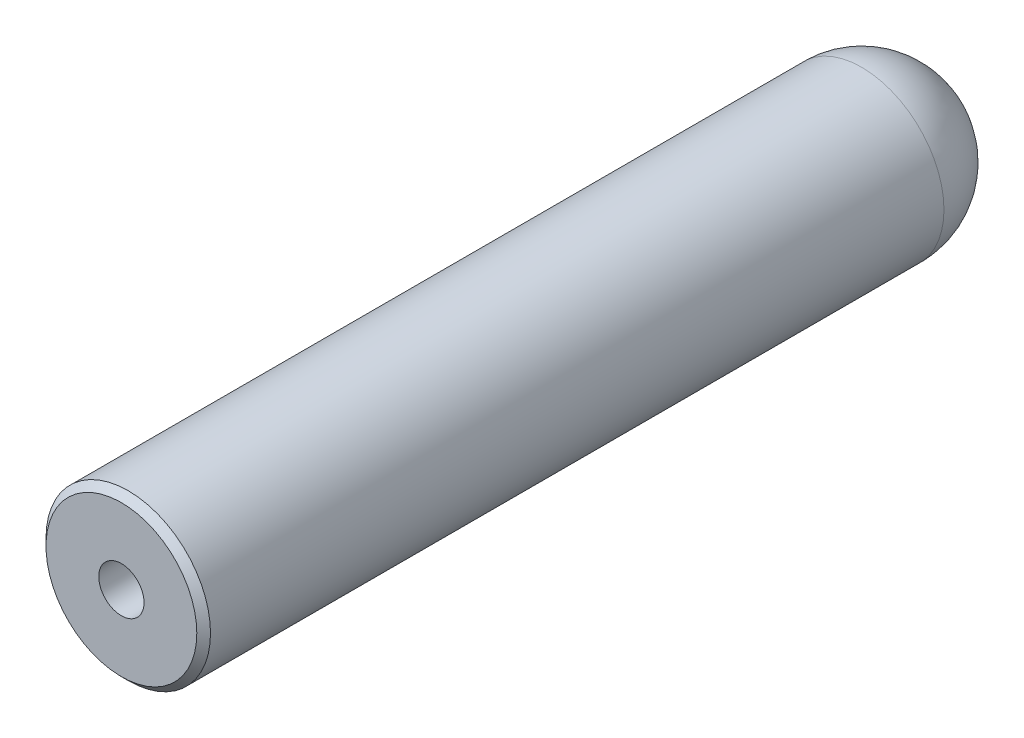
ISO-10303-21;
HEADER;
FILE_DESCRIPTION(('STEP AP214'),'2;1');
FILE_NAME('part.step','',(''),(''),'','','');
FILE_SCHEMA(('AUTOMOTIVE_DESIGN { 1 0 10303 214 1 1 1 1 }'));
ENDSEC;
DATA;
#1=APPLICATION_CONTEXT('core data for automotive mechanical design processes');
#2=APPLICATION_PROTOCOL_DEFINITION('international standard','automotive_design',2000,#1);
#3=PRODUCT_CONTEXT('',#1,'mechanical');
#4=PRODUCT('Part','Part','',(#3));
#5=PRODUCT_RELATED_PRODUCT_CATEGORY('part','',(#4));
#6=PRODUCT_DEFINITION_FORMATION('','',#4);
#7=PRODUCT_DEFINITION_CONTEXT('part definition',#1,'design');
#8=PRODUCT_DEFINITION('design','',#6,#7);
#9=PRODUCT_DEFINITION_SHAPE('','',#8);
#10=(LENGTH_UNIT() NAMED_UNIT(*) SI_UNIT(.MILLI.,.METRE.));
#11=(NAMED_UNIT(*) PLANE_ANGLE_UNIT() SI_UNIT($,.RADIAN.));
#12=(NAMED_UNIT(*) SI_UNIT($,.STERADIAN.) SOLID_ANGLE_UNIT());
#13=UNCERTAINTY_MEASURE_WITH_UNIT(LENGTH_MEASURE(1.E-05),#10,'distance_accuracy_value','');
#14=(GEOMETRIC_REPRESENTATION_CONTEXT(3) GLOBAL_UNCERTAINTY_ASSIGNED_CONTEXT((#13)) GLOBAL_UNIT_ASSIGNED_CONTEXT((#10,
#11,#12)) REPRESENTATION_CONTEXT('',''));
#15=CARTESIAN_POINT('',(0.,0.,0.));
#16=DIRECTION('',(0.,0.,1.));
#17=DIRECTION('',(1.,0.,0.));
#18=AXIS2_PLACEMENT_3D('',#15,#16,#17);
#19=CARTESIAN_POINT('',(0.,0.,60.));
#20=DIRECTION('',(0.,0.,-1.));
#21=DIRECTION('',(-1.,0.,0.));
#22=AXIS2_PLACEMENT_3D('',#19,#20,#21);
#23=CYLINDRICAL_SURFACE('',#22,6.);
#24=CARTESIAN_POINT('',(0.,0.,59.5));
#25=DIRECTION('',(0.,0.,1.));
#26=DIRECTION('',(1.,0.,0.));
#27=AXIS2_PLACEMENT_3D('',#24,#25,#26);
#28=CIRCLE('',#27,6.);
#29=CARTESIAN_POINT('',(6.,0.,59.5));
#30=VERTEX_POINT('',#29);
#31=EDGE_CURVE('E11',#30,#30,#28,.F.);
#32=ORIENTED_EDGE('',*,*,#31,.T.);
#33=EDGE_LOOP('',(#32));
#34=FACE_BOUND('',#33,.T.);
#35=CARTESIAN_POINT('',(0.,0.,6.));
#36=DIRECTION('',(0.,0.,-1.));
#37=DIRECTION('',(-1.,0.,0.));
#38=AXIS2_PLACEMENT_3D('',#35,#36,#37);
#39=CIRCLE('',#38,6.);
#40=CARTESIAN_POINT('',(-6.,0.,6.));
#41=VERTEX_POINT('',#40);
#42=EDGE_CURVE('E60',#41,#41,#39,.F.);
#43=ORIENTED_EDGE('',*,*,#42,.T.);
#44=EDGE_LOOP('',(#43));
#45=FACE_BOUND('',#44,.T.);
#46=ADVANCED_FACE('F41',(#34,#45),#23,.T.);
#47=CARTESIAN_POINT('',(0.,0.,60.));
#48=DIRECTION('',(0.,0.,1.));
#49=DIRECTION('',(1.,0.,0.));
#50=AXIS2_PLACEMENT_3D('',#47,#48,#49);
#51=PLANE('',#50);
#52=CARTESIAN_POINT('',(0.,0.,60.));
#53=DIRECTION('',(0.,0.,1.));
#54=DIRECTION('',(1.,0.,0.));
#55=AXIS2_PLACEMENT_3D('',#52,#53,#54);
#56=CIRCLE('',#55,1.64999999999999);
#57=CARTESIAN_POINT('',(1.64999999999999,0.,60.));
#58=VERTEX_POINT('',#57);
#59=EDGE_CURVE('E61',#58,#58,#56,.T.);
#60=ORIENTED_EDGE('',*,*,#59,.F.);
#61=EDGE_LOOP('',(#60));
#62=FACE_BOUND('',#61,.T.);
#63=CARTESIAN_POINT('',(0.,0.,60.));
#64=DIRECTION('',(0.,0.,1.));
#65=DIRECTION('',(1.,0.,0.));
#66=AXIS2_PLACEMENT_3D('',#63,#64,#65);
#67=CIRCLE('',#66,5.49999999999999);
#68=CARTESIAN_POINT('',(5.49999999999999,0.,60.));
#69=VERTEX_POINT('',#68);
#70=EDGE_CURVE('E48',#69,#69,#67,.T.);
#71=ORIENTED_EDGE('',*,*,#70,.T.);
#72=EDGE_LOOP('',(#71));
#73=FACE_BOUND('',#72,.T.);
#74=ADVANCED_FACE('F70',(#62,#73),#51,.T.);
#75=CARTESIAN_POINT('',(0.,0.,6.));
#76=DIRECTION('',(0.,0.,1.));
#77=DIRECTION('',(1.,0.,0.));
#78=AXIS2_PLACEMENT_3D('',#75,#76,#77);
#79=SPHERICAL_SURFACE('',#78,6.);
#80=ORIENTED_EDGE('',*,*,#42,.F.);
#81=EDGE_LOOP('',(#80));
#82=FACE_BOUND('',#81,.T.);
#83=ADVANCED_FACE('F73',(#82),#79,.T.);
#84=CARTESIAN_POINT('',(0.,0.,60.));
#85=DIRECTION('',(0.,0.,-1.));
#86=DIRECTION('',(-1.,0.,0.));
#87=AXIS2_PLACEMENT_3D('',#84,#85,#86);
#88=CONICAL_SURFACE('',#87,5.49999999999999,0.785398163397446);
#89=ORIENTED_EDGE('',*,*,#31,.F.);
#90=EDGE_LOOP('',(#89));
#91=FACE_BOUND('',#90,.T.);
#92=ORIENTED_EDGE('',*,*,#70,.F.);
#93=EDGE_LOOP('',(#92));
#94=FACE_BOUND('',#93,.T.);
#95=ADVANCED_FACE('F43',(#91,#94),#88,.T.);
#96=CARTESIAN_POINT('',(0.,0.,48.5));
#97=DIRECTION('',(0.,0.,1.));
#98=DIRECTION('',(1.,0.,0.));
#99=AXIS2_PLACEMENT_3D('',#96,#97,#98);
#100=CONICAL_SURFACE('',#99,1.64999999999999,1.02974425867665);
#101=CARTESIAN_POINT('',(0.,0.,47.5085799786045));
#102=VERTEX_POINT('',#101);
#103=VERTEX_LOOP('',#102);
#104=FACE_BOUND('',#103,.T.);
#105=CARTESIAN_POINT('',(0.,0.,48.5));
#106=DIRECTION('',(0.,0.,1.));
#107=DIRECTION('',(1.,0.,0.));
#108=AXIS2_PLACEMENT_3D('',#105,#106,#107);
#109=CIRCLE('',#108,1.64999999999999);
#110=CARTESIAN_POINT('',(1.64999999999999,0.,48.5));
#111=VERTEX_POINT('',#110);
#112=EDGE_CURVE('E58',#111,#111,#109,.T.);
#113=ORIENTED_EDGE('',*,*,#112,.T.);
#114=EDGE_LOOP('',(#113));
#115=FACE_BOUND('',#114,.T.);
#116=ADVANCED_FACE('F51',(#104,#115),#100,.F.);
#117=CARTESIAN_POINT('',(0.,0.,60.));
#118=DIRECTION('',(0.,0.,1.));
#119=DIRECTION('',(1.,0.,0.));
#120=AXIS2_PLACEMENT_3D('',#117,#118,#119);
#121=CYLINDRICAL_SURFACE('',#120,1.64999999999999);
#122=ORIENTED_EDGE('',*,*,#112,.F.);
#123=EDGE_LOOP('',(#122));
#124=FACE_BOUND('',#123,.T.);
#125=ORIENTED_EDGE('',*,*,#59,.T.);
#126=EDGE_LOOP('',(#125));
#127=FACE_BOUND('',#126,.T.);
#128=ADVANCED_FACE('F54',(#124,#127),#121,.F.);
#129=CLOSED_SHELL('',(#46,#74,#83,#95,#116,#128));
#130=MANIFOLD_SOLID_BREP('B2',#129);
#131=ADVANCED_BREP_SHAPE_REPRESENTATION('',(#18,#130),#14);
#132=SHAPE_DEFINITION_REPRESENTATION(#9,#131);
ENDSEC;
END-ISO-10303-21;
